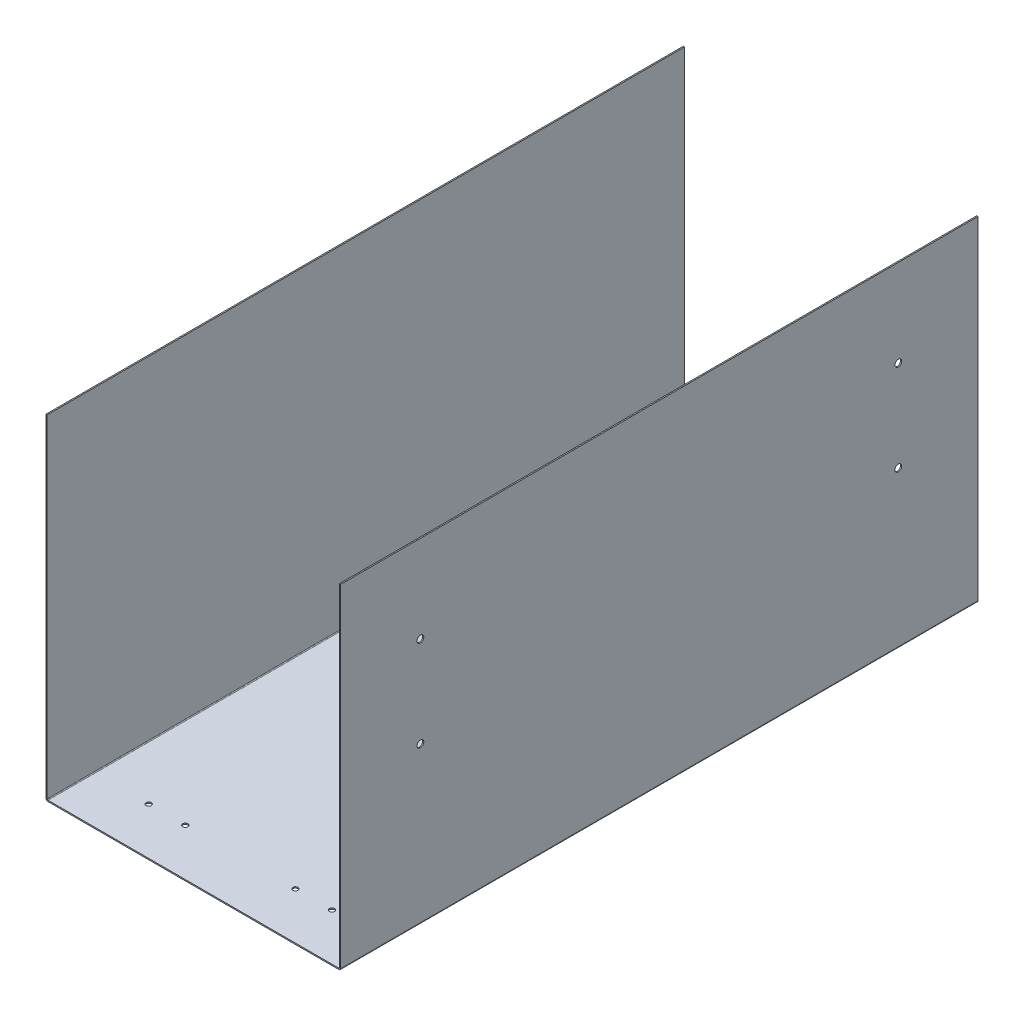
ISO-10303-21;
HEADER;
FILE_DESCRIPTION(('STEP AP214'),'2;1');
FILE_NAME('part.step','',(''),(''),'','','');
FILE_SCHEMA(('AUTOMOTIVE_DESIGN { 1 0 10303 214 1 1 1 1 }'));
ENDSEC;
DATA;
#1=APPLICATION_CONTEXT('core data for automotive mechanical design processes');
#2=APPLICATION_PROTOCOL_DEFINITION('international standard','automotive_design',2000,#1);
#3=PRODUCT_CONTEXT('',#1,'mechanical');
#4=PRODUCT('Part','Part','',(#3));
#5=PRODUCT_RELATED_PRODUCT_CATEGORY('part','',(#4));
#6=PRODUCT_DEFINITION_FORMATION('','',#4);
#7=PRODUCT_DEFINITION_CONTEXT('part definition',#1,'design');
#8=PRODUCT_DEFINITION('design','',#6,#7);
#9=PRODUCT_DEFINITION_SHAPE('','',#8);
#10=(LENGTH_UNIT() NAMED_UNIT(*) SI_UNIT(.MILLI.,.METRE.));
#11=(NAMED_UNIT(*) PLANE_ANGLE_UNIT() SI_UNIT($,.RADIAN.));
#12=(NAMED_UNIT(*) SI_UNIT($,.STERADIAN.) SOLID_ANGLE_UNIT());
#13=UNCERTAINTY_MEASURE_WITH_UNIT(LENGTH_MEASURE(1.E-05),#10,'distance_accuracy_value','');
#14=(GEOMETRIC_REPRESENTATION_CONTEXT(3) GLOBAL_UNCERTAINTY_ASSIGNED_CONTEXT((#13)) GLOBAL_UNIT_ASSIGNED_CONTEXT((#10,
#11,#12)) REPRESENTATION_CONTEXT('',''));
#15=CARTESIAN_POINT('',(0.,0.,0.));
#16=DIRECTION('',(0.,0.,1.));
#17=DIRECTION('',(1.,0.,0.));
#18=AXIS2_PLACEMENT_3D('',#15,#16,#17);
#19=CARTESIAN_POINT('',(182.5,1.11022302462516E-13,400.));
#20=DIRECTION('',(0.,0.,1.));
#21=DIRECTION('',(1.,0.,0.));
#22=AXIS2_PLACEMENT_3D('',#19,#20,#21);
#23=PLANE('',#22);
#24=DIRECTION('',(0.,1.,0.));
#25=VECTOR('',#24,1.);
#26=CARTESIAN_POINT('',(182.5,1.11022302462516E-13,400.));
#27=LINE('',#26,#25);
#28=CARTESIAN_POINT('',(182.5,1.11022302462516E-13,400.));
#29=VERTEX_POINT('',#28);
#30=CARTESIAN_POINT('',(182.5,1.50000000000006,400.));
#31=VERTEX_POINT('',#30);
#32=EDGE_CURVE('E11',#29,#31,#27,.T.);
#33=ORIENTED_EDGE('',*,*,#32,.F.);
#34=CARTESIAN_POINT('',(182.5,2.50000000000006,400.));
#35=DIRECTION('',(0.,0.,1.));
#36=DIRECTION('',(1.,0.,0.));
#37=AXIS2_PLACEMENT_3D('',#34,#35,#36);
#38=CIRCLE('',#37,2.5);
#39=CARTESIAN_POINT('',(185.,2.50000000000006,400.));
#40=VERTEX_POINT('',#39);
#41=EDGE_CURVE('E321',#40,#29,#38,.F.);
#42=ORIENTED_EDGE('',*,*,#41,.F.);
#43=DIRECTION('',(1.,0.,0.));
#44=VECTOR('',#43,1.);
#45=CARTESIAN_POINT('',(183.5,2.50000000000006,400.));
#46=LINE('',#45,#44);
#47=CARTESIAN_POINT('',(183.5,2.50000000000006,400.));
#48=VERTEX_POINT('',#47);
#49=EDGE_CURVE('E55',#48,#40,#46,.T.);
#50=ORIENTED_EDGE('',*,*,#49,.F.);
#51=CARTESIAN_POINT('',(182.5,2.50000000000006,400.));
#52=DIRECTION('',(0.,0.,1.));
#53=DIRECTION('',(1.,0.,0.));
#54=AXIS2_PLACEMENT_3D('',#51,#52,#53);
#55=CIRCLE('',#54,1.);
#56=EDGE_CURVE('E157',#48,#31,#55,.F.);
#57=ORIENTED_EDGE('',*,*,#56,.T.);
#58=EDGE_LOOP('',(#33,#42,#50,#57));
#59=FACE_BOUND('',#58,.T.);
#60=ADVANCED_FACE('F46',(#59),#23,.T.);
#61=CARTESIAN_POINT('',(183.5,2.50000000000006,400.));
#62=DIRECTION('',(0.,0.,1.));
#63=DIRECTION('',(1.,0.,0.));
#64=AXIS2_PLACEMENT_3D('',#61,#62,#63);
#65=PLANE('',#64);
#66=DIRECTION('',(-1.,0.,0.));
#67=VECTOR('',#66,1.);
#68=CARTESIAN_POINT('',(-185.,0.,400.));
#69=LINE('',#68,#67);
#70=CARTESIAN_POINT('',(-182.5,0.,400.));
#71=VERTEX_POINT('',#70);
#72=EDGE_CURVE('E151',#29,#71,#69,.T.);
#73=ORIENTED_EDGE('',*,*,#72,.F.);
#74=ORIENTED_EDGE('',*,*,#32,.T.);
#75=DIRECTION('',(-1.,0.,0.));
#76=VECTOR('',#75,1.);
#77=CARTESIAN_POINT('',(-185.,1.49999999999995,400.));
#78=LINE('',#77,#76);
#79=CARTESIAN_POINT('',(-182.5,1.49999999999995,400.));
#80=VERTEX_POINT('',#79);
#81=EDGE_CURVE('E148',#31,#80,#78,.T.);
#82=ORIENTED_EDGE('',*,*,#81,.T.);
#83=DIRECTION('',(0.,-1.,0.));
#84=VECTOR('',#83,1.);
#85=CARTESIAN_POINT('',(-182.5,1.49999999999995,400.));
#86=LINE('',#85,#84);
#87=EDGE_CURVE('E240',#80,#71,#86,.T.);
#88=ORIENTED_EDGE('',*,*,#87,.T.);
#89=EDGE_LOOP('',(#73,#74,#82,#88));
#90=FACE_BOUND('',#89,.T.);
#91=ADVANCED_FACE('F146',(#90),#65,.T.);
#92=CARTESIAN_POINT('',(185.,2.50000000000006,-400.));
#93=DIRECTION('',(0.,0.,-1.));
#94=DIRECTION('',(-1.,0.,0.));
#95=AXIS2_PLACEMENT_3D('',#92,#93,#94);
#96=PLANE('',#95);
#97=DIRECTION('',(-1.,0.,0.));
#98=VECTOR('',#97,1.);
#99=CARTESIAN_POINT('',(185.,2.50000000000006,-400.));
#100=LINE('',#99,#98);
#101=CARTESIAN_POINT('',(185.,2.50000000000006,-400.));
#102=VERTEX_POINT('',#101);
#103=CARTESIAN_POINT('',(183.5,2.50000000000006,-400.));
#104=VERTEX_POINT('',#103);
#105=EDGE_CURVE('E245',#102,#104,#100,.T.);
#106=ORIENTED_EDGE('',*,*,#105,.F.);
#107=CARTESIAN_POINT('',(182.5,2.50000000000006,-400.));
#108=DIRECTION('',(0.,0.,1.));
#109=DIRECTION('',(1.,0.,0.));
#110=AXIS2_PLACEMENT_3D('',#107,#108,#109);
#111=CIRCLE('',#110,2.5);
#112=CARTESIAN_POINT('',(182.5,1.11022302462516E-13,-400.));
#113=VERTEX_POINT('',#112);
#114=EDGE_CURVE('E197',#102,#113,#111,.F.);
#115=ORIENTED_EDGE('',*,*,#114,.T.);
#116=DIRECTION('',(0.,-1.,0.));
#117=VECTOR('',#116,1.);
#118=CARTESIAN_POINT('',(182.5,1.50000000000006,-400.));
#119=LINE('',#118,#117);
#120=CARTESIAN_POINT('',(182.5,1.50000000000006,-400.));
#121=VERTEX_POINT('',#120);
#122=EDGE_CURVE('E243',#121,#113,#119,.T.);
#123=ORIENTED_EDGE('',*,*,#122,.F.);
#124=CARTESIAN_POINT('',(182.5,2.50000000000006,-400.));
#125=DIRECTION('',(0.,0.,1.));
#126=DIRECTION('',(1.,0.,0.));
#127=AXIS2_PLACEMENT_3D('',#124,#125,#126);
#128=CIRCLE('',#127,1.);
#129=EDGE_CURVE('E169',#104,#121,#128,.F.);
#130=ORIENTED_EDGE('',*,*,#129,.F.);
#131=EDGE_LOOP('',(#106,#115,#123,#130));
#132=FACE_BOUND('',#131,.T.);
#133=ADVANCED_FACE('F339',(#132),#96,.T.);
#134=CARTESIAN_POINT('',(182.5,1.50000000000006,-400.));
#135=DIRECTION('',(0.,0.,-1.));
#136=DIRECTION('',(-1.,0.,0.));
#137=AXIS2_PLACEMENT_3D('',#134,#135,#136);
#138=PLANE('',#137);
#139=DIRECTION('',(0.,-1.,0.));
#140=VECTOR('',#139,1.);
#141=CARTESIAN_POINT('',(185.,1.11022302462516E-13,-400.));
#142=LINE('',#141,#140);
#143=CARTESIAN_POINT('',(185.,420.,-400.));
#144=VERTEX_POINT('',#143);
#145=EDGE_CURVE('E200',#144,#102,#142,.T.);
#146=ORIENTED_EDGE('',*,*,#145,.T.);
#147=ORIENTED_EDGE('',*,*,#105,.T.);
#148=DIRECTION('',(0.,-1.,0.));
#149=VECTOR('',#148,1.);
#150=CARTESIAN_POINT('',(183.5,1.11022302462516E-13,-400.));
#151=LINE('',#150,#149);
#152=CARTESIAN_POINT('',(183.5,420.,-400.));
#153=VERTEX_POINT('',#152);
#154=EDGE_CURVE('E206',#153,#104,#151,.T.);
#155=ORIENTED_EDGE('',*,*,#154,.F.);
#156=DIRECTION('',(1.,0.,0.));
#157=VECTOR('',#156,1.);
#158=CARTESIAN_POINT('',(183.5,420.,-400.));
#159=LINE('',#158,#157);
#160=EDGE_CURVE('E203',#153,#144,#159,.T.);
#161=ORIENTED_EDGE('',*,*,#160,.T.);
#162=EDGE_LOOP('',(#146,#147,#155,#161));
#163=FACE_BOUND('',#162,.T.);
#164=ADVANCED_FACE('F384',(#163),#138,.T.);
#165=CARTESIAN_POINT('',(-185.,2.49999999999995,400.));
#166=DIRECTION('',(0.,0.,1.));
#167=DIRECTION('',(1.,0.,0.));
#168=AXIS2_PLACEMENT_3D('',#165,#166,#167);
#169=PLANE('',#168);
#170=DIRECTION('',(1.,0.,0.));
#171=VECTOR('',#170,1.);
#172=CARTESIAN_POINT('',(-185.,2.49999999999995,400.));
#173=LINE('',#172,#171);
#174=CARTESIAN_POINT('',(-185.,2.49999999999995,400.));
#175=VERTEX_POINT('',#174);
#176=CARTESIAN_POINT('',(-183.5,2.49999999999995,400.));
#177=VERTEX_POINT('',#176);
#178=EDGE_CURVE('E64',#175,#177,#173,.T.);
#179=ORIENTED_EDGE('',*,*,#178,.F.);
#180=CARTESIAN_POINT('',(-182.5,2.49999999999995,400.));
#181=DIRECTION('',(0.,0.,1.));
#182=DIRECTION('',(1.,0.,0.));
#183=AXIS2_PLACEMENT_3D('',#180,#181,#182);
#184=CIRCLE('',#183,2.5);
#185=EDGE_CURVE('E317',#71,#175,#184,.F.);
#186=ORIENTED_EDGE('',*,*,#185,.F.);
#187=ORIENTED_EDGE('',*,*,#87,.F.);
#188=CARTESIAN_POINT('',(-182.5,2.49999999999995,400.));
#189=DIRECTION('',(0.,0.,1.));
#190=DIRECTION('',(1.,0.,0.));
#191=AXIS2_PLACEMENT_3D('',#188,#189,#190);
#192=CIRCLE('',#191,1.);
#193=EDGE_CURVE('E177',#80,#177,#192,.F.);
#194=ORIENTED_EDGE('',*,*,#193,.T.);
#195=EDGE_LOOP('',(#179,#186,#187,#194));
#196=FACE_BOUND('',#195,.T.);
#197=ADVANCED_FACE('F389',(#196),#169,.T.);
#198=CARTESIAN_POINT('',(-182.5,1.49999999999995,400.));
#199=DIRECTION('',(0.,0.,1.));
#200=DIRECTION('',(1.,0.,0.));
#201=AXIS2_PLACEMENT_3D('',#198,#199,#200);
#202=PLANE('',#201);
#203=DIRECTION('',(0.,1.,0.));
#204=VECTOR('',#203,1.);
#205=CARTESIAN_POINT('',(-185.,0.,400.));
#206=LINE('',#205,#204);
#207=CARTESIAN_POINT('',(-185.,420.,400.));
#208=VERTEX_POINT('',#207);
#209=EDGE_CURVE('E314',#175,#208,#206,.T.);
#210=ORIENTED_EDGE('',*,*,#209,.F.);
#211=ORIENTED_EDGE('',*,*,#178,.T.);
#212=DIRECTION('',(0.,1.,0.));
#213=VECTOR('',#212,1.);
#214=CARTESIAN_POINT('',(-183.5,0.,400.));
#215=LINE('',#214,#213);
#216=CARTESIAN_POINT('',(-183.5,420.,400.));
#217=VERTEX_POINT('',#216);
#218=EDGE_CURVE('E118',#177,#217,#215,.T.);
#219=ORIENTED_EDGE('',*,*,#218,.T.);
#220=DIRECTION('',(1.,0.,0.));
#221=VECTOR('',#220,1.);
#222=CARTESIAN_POINT('',(-185.,420.,400.));
#223=LINE('',#222,#221);
#224=EDGE_CURVE('E311',#208,#217,#223,.T.);
#225=ORIENTED_EDGE('',*,*,#224,.F.);
#226=EDGE_LOOP('',(#210,#211,#219,#225));
#227=FACE_BOUND('',#226,.T.);
#228=ADVANCED_FACE('F366',(#227),#202,.T.);
#229=CARTESIAN_POINT('',(-182.5,0.,-400.));
#230=DIRECTION('',(0.,0.,-1.));
#231=DIRECTION('',(-1.,0.,0.));
#232=AXIS2_PLACEMENT_3D('',#229,#230,#231);
#233=PLANE('',#232);
#234=DIRECTION('',(0.,1.,0.));
#235=VECTOR('',#234,1.);
#236=CARTESIAN_POINT('',(-182.5,0.,-400.));
#237=LINE('',#236,#235);
#238=CARTESIAN_POINT('',(-182.5,0.,-400.));
#239=VERTEX_POINT('',#238);
#240=CARTESIAN_POINT('',(-182.5,1.49999999999995,-400.));
#241=VERTEX_POINT('',#240);
#242=EDGE_CURVE('E105',#239,#241,#237,.T.);
#243=ORIENTED_EDGE('',*,*,#242,.F.);
#244=CARTESIAN_POINT('',(-182.5,2.49999999999995,-400.));
#245=DIRECTION('',(0.,0.,1.));
#246=DIRECTION('',(1.,0.,0.));
#247=AXIS2_PLACEMENT_3D('',#244,#245,#246);
#248=CIRCLE('',#247,2.5);
#249=CARTESIAN_POINT('',(-185.,2.49999999999995,-400.));
#250=VERTEX_POINT('',#249);
#251=EDGE_CURVE('E193',#239,#250,#248,.F.);
#252=ORIENTED_EDGE('',*,*,#251,.T.);
#253=DIRECTION('',(-1.,0.,0.));
#254=VECTOR('',#253,1.);
#255=CARTESIAN_POINT('',(-183.5,2.49999999999995,-400.));
#256=LINE('',#255,#254);
#257=CARTESIAN_POINT('',(-183.5,2.49999999999995,-400.));
#258=VERTEX_POINT('',#257);
#259=EDGE_CURVE('E112',#258,#250,#256,.T.);
#260=ORIENTED_EDGE('',*,*,#259,.F.);
#261=CARTESIAN_POINT('',(-182.5,2.49999999999995,-400.));
#262=DIRECTION('',(0.,0.,1.));
#263=DIRECTION('',(1.,0.,0.));
#264=AXIS2_PLACEMENT_3D('',#261,#262,#263);
#265=CIRCLE('',#264,1.);
#266=EDGE_CURVE('E212',#241,#258,#265,.F.);
#267=ORIENTED_EDGE('',*,*,#266,.F.);
#268=EDGE_LOOP('',(#243,#252,#260,#267));
#269=FACE_BOUND('',#268,.T.);
#270=ADVANCED_FACE('F354',(#269),#233,.T.);
#271=CARTESIAN_POINT('',(-183.5,2.49999999999995,-400.));
#272=DIRECTION('',(0.,0.,-1.));
#273=DIRECTION('',(-1.,0.,0.));
#274=AXIS2_PLACEMENT_3D('',#271,#272,#273);
#275=PLANE('',#274);
#276=DIRECTION('',(-1.,0.,0.));
#277=VECTOR('',#276,1.);
#278=CARTESIAN_POINT('',(-185.,0.,-400.));
#279=LINE('',#278,#277);
#280=EDGE_CURVE('E195',#113,#239,#279,.T.);
#281=ORIENTED_EDGE('',*,*,#280,.T.);
#282=ORIENTED_EDGE('',*,*,#242,.T.);
#283=DIRECTION('',(-1.,0.,0.));
#284=VECTOR('',#283,1.);
#285=CARTESIAN_POINT('',(-185.,1.49999999999995,-400.));
#286=LINE('',#285,#284);
#287=EDGE_CURVE('E210',#121,#241,#286,.T.);
#288=ORIENTED_EDGE('',*,*,#287,.F.);
#289=ORIENTED_EDGE('',*,*,#122,.T.);
#290=EDGE_LOOP('',(#281,#282,#288,#289));
#291=FACE_BOUND('',#290,.T.);
#292=ADVANCED_FACE('F341',(#291),#275,.T.);
#293=CARTESIAN_POINT('',(-183.5,0.,400.));
#294=DIRECTION('',(-1.,0.,0.));
#295=DIRECTION('',(0.,0.,1.));
#296=AXIS2_PLACEMENT_3D('',#293,#294,#295);
#297=PLANE('',#296);
#298=DIRECTION('',(0.,1.,0.));
#299=VECTOR('',#298,1.);
#300=CARTESIAN_POINT('',(-183.5,0.,-400.));
#301=LINE('',#300,#299);
#302=CARTESIAN_POINT('',(-183.5,420.,-400.));
#303=VERTEX_POINT('',#302);
#304=EDGE_CURVE('E183',#258,#303,#301,.T.);
#305=ORIENTED_EDGE('',*,*,#304,.T.);
#306=DIRECTION('',(0.,0.,-1.));
#307=VECTOR('',#306,1.);
#308=CARTESIAN_POINT('',(-183.5,420.,400.));
#309=LINE('',#308,#307);
#310=EDGE_CURVE('E236',#217,#303,#309,.T.);
#311=ORIENTED_EDGE('',*,*,#310,.F.);
#312=ORIENTED_EDGE('',*,*,#218,.F.);
#313=DIRECTION('',(0.,0.,-1.));
#314=VECTOR('',#313,1.);
#315=CARTESIAN_POINT('',(-183.5,2.49999999999995,400.));
#316=LINE('',#315,#314);
#317=EDGE_CURVE('E179',#177,#258,#316,.T.);
#318=ORIENTED_EDGE('',*,*,#317,.T.);
#319=EDGE_LOOP('',(#305,#311,#312,#318));
#320=FACE_BOUND('',#319,.T.);
#321=ADVANCED_FACE('F360',(#320),#297,.F.);
#322=CARTESIAN_POINT('',(-185.,420.,400.));
#323=DIRECTION('',(0.,1.,0.));
#324=DIRECTION('',(0.,0.,1.));
#325=AXIS2_PLACEMENT_3D('',#322,#323,#324);
#326=PLANE('',#325);
#327=DIRECTION('',(1.,0.,0.));
#328=VECTOR('',#327,1.);
#329=CARTESIAN_POINT('',(-185.,420.,-400.));
#330=LINE('',#329,#328);
#331=CARTESIAN_POINT('',(-185.,420.,-400.));
#332=VERTEX_POINT('',#331);
#333=EDGE_CURVE('E186',#332,#303,#330,.T.);
#334=ORIENTED_EDGE('',*,*,#333,.F.);
#335=DIRECTION('',(0.,0.,-1.));
#336=VECTOR('',#335,1.);
#337=CARTESIAN_POINT('',(-185.,420.,400.));
#338=LINE('',#337,#336);
#339=EDGE_CURVE('E234',#208,#332,#338,.T.);
#340=ORIENTED_EDGE('',*,*,#339,.F.);
#341=ORIENTED_EDGE('',*,*,#224,.T.);
#342=ORIENTED_EDGE('',*,*,#310,.T.);
#343=EDGE_LOOP('',(#334,#340,#341,#342));
#344=FACE_BOUND('',#343,.T.);
#345=ADVANCED_FACE('F365',(#344),#326,.T.);
#346=CARTESIAN_POINT('',(-185.,0.,400.));
#347=DIRECTION('',(-1.,0.,0.));
#348=DIRECTION('',(0.,0.,1.));
#349=AXIS2_PLACEMENT_3D('',#346,#347,#348);
#350=PLANE('',#349);
#351=DIRECTION('',(0.,1.,0.));
#352=VECTOR('',#351,1.);
#353=CARTESIAN_POINT('',(-185.,0.,-400.));
#354=LINE('',#353,#352);
#355=EDGE_CURVE('E190',#250,#332,#354,.T.);
#356=ORIENTED_EDGE('',*,*,#355,.F.);
#357=DIRECTION('',(0.,0.,-1.));
#358=VECTOR('',#357,1.);
#359=CARTESIAN_POINT('',(-185.,2.49999999999995,400.));
#360=LINE('',#359,#358);
#361=EDGE_CURVE('E231',#175,#250,#360,.T.);
#362=ORIENTED_EDGE('',*,*,#361,.F.);
#363=ORIENTED_EDGE('',*,*,#209,.T.);
#364=ORIENTED_EDGE('',*,*,#339,.T.);
#365=EDGE_LOOP('',(#356,#362,#363,#364));
#366=FACE_BOUND('',#365,.T.);
#367=ADVANCED_FACE('F368',(#366),#350,.T.);
#368=CARTESIAN_POINT('',(-182.5,2.49999999999995,400.));
#369=DIRECTION('',(0.,0.,-1.));
#370=DIRECTION('',(-1.,0.,0.));
#371=AXIS2_PLACEMENT_3D('',#368,#369,#370);
#372=CYLINDRICAL_SURFACE('',#371,2.5);
#373=ORIENTED_EDGE('',*,*,#251,.F.);
#374=DIRECTION('',(0.,0.,-1.));
#375=VECTOR('',#374,1.);
#376=CARTESIAN_POINT('',(-182.5,0.,400.));
#377=LINE('',#376,#375);
#378=EDGE_CURVE('E228',#71,#239,#377,.T.);
#379=ORIENTED_EDGE('',*,*,#378,.F.);
#380=ORIENTED_EDGE('',*,*,#185,.T.);
#381=ORIENTED_EDGE('',*,*,#361,.T.);
#382=EDGE_LOOP('',(#373,#379,#380,#381));
#383=FACE_BOUND('',#382,.T.);
#384=ADVANCED_FACE('F351',(#383),#372,.T.);
#385=CARTESIAN_POINT('',(-185.,0.,400.));
#386=DIRECTION('',(0.,-1.,0.));
#387=DIRECTION('',(1.,0.,0.));
#388=AXIS2_PLACEMENT_3D('',#385,#386,#387);
#389=PLANE('',#388);
#390=CARTESIAN_POINT('',(-69.1253140723345,0.,341.));
#391=DIRECTION('',(0.,-1.,0.));
#392=DIRECTION('',(1.,0.,0.));
#393=AXIS2_PLACEMENT_3D('',#390,#391,#392);
#394=CIRCLE('',#393,3.25000000000002);
#395=CARTESIAN_POINT('',(-65.8753140723344,0.,341.));
#396=VERTEX_POINT('',#395);
#397=EDGE_CURVE('E296',#396,#396,#394,.T.);
#398=ORIENTED_EDGE('',*,*,#397,.F.);
#399=EDGE_LOOP('',(#398));
#400=FACE_BOUND('',#399,.T.);
#401=CARTESIAN_POINT('',(69.1253140723345,0.,341.));
#402=DIRECTION('',(0.,-1.,0.));
#403=DIRECTION('',(-1.,0.,0.));
#404=AXIS2_PLACEMENT_3D('',#401,#402,#403);
#405=CIRCLE('',#404,3.25000000000002);
#406=CARTESIAN_POINT('',(65.8753140723344,0.,341.));
#407=VERTEX_POINT('',#406);
#408=EDGE_CURVE('E299',#407,#407,#405,.T.);
#409=ORIENTED_EDGE('',*,*,#408,.F.);
#410=EDGE_LOOP('',(#409));
#411=FACE_BOUND('',#410,.T.);
#412=CARTESIAN_POINT('',(115.125314072335,0.,341.));
#413=DIRECTION('',(0.,-1.,0.));
#414=DIRECTION('',(-1.,0.,0.));
#415=AXIS2_PLACEMENT_3D('',#412,#413,#414);
#416=CIRCLE('',#415,3.25000000000001);
#417=CARTESIAN_POINT('',(111.875314072335,0.,341.));
#418=VERTEX_POINT('',#417);
#419=EDGE_CURVE('E302',#418,#418,#416,.T.);
#420=ORIENTED_EDGE('',*,*,#419,.F.);
#421=EDGE_LOOP('',(#420));
#422=FACE_BOUND('',#421,.T.);
#423=CARTESIAN_POINT('',(115.125314072335,0.,-341.));
#424=DIRECTION('',(0.,-1.,0.));
#425=DIRECTION('',(1.,0.,0.));
#426=AXIS2_PLACEMENT_3D('',#423,#424,#425);
#427=CIRCLE('',#426,3.25000000000001);
#428=CARTESIAN_POINT('',(118.375314072335,0.,-341.));
#429=VERTEX_POINT('',#428);
#430=EDGE_CURVE('E305',#429,#429,#427,.T.);
#431=ORIENTED_EDGE('',*,*,#430,.F.);
#432=EDGE_LOOP('',(#431));
#433=FACE_BOUND('',#432,.T.);
#434=CARTESIAN_POINT('',(69.1253140723345,0.,-341.));
#435=DIRECTION('',(0.,-1.,0.));
#436=DIRECTION('',(1.,0.,0.));
#437=AXIS2_PLACEMENT_3D('',#434,#435,#436);
#438=CIRCLE('',#437,3.25000000000002);
#439=CARTESIAN_POINT('',(72.3753140723345,0.,-341.));
#440=VERTEX_POINT('',#439);
#441=EDGE_CURVE('E292',#440,#440,#438,.T.);
#442=ORIENTED_EDGE('',*,*,#441,.F.);
#443=EDGE_LOOP('',(#442));
#444=FACE_BOUND('',#443,.T.);
#445=CARTESIAN_POINT('',(-69.1253140723345,0.,-341.));
#446=DIRECTION('',(0.,-1.,0.));
#447=DIRECTION('',(-1.,0.,0.));
#448=AXIS2_PLACEMENT_3D('',#445,#446,#447);
#449=CIRCLE('',#448,3.25000000000002);
#450=CARTESIAN_POINT('',(-72.3753140723345,0.,-341.));
#451=VERTEX_POINT('',#450);
#452=EDGE_CURVE('E287',#451,#451,#449,.T.);
#453=ORIENTED_EDGE('',*,*,#452,.F.);
#454=EDGE_LOOP('',(#453));
#455=FACE_BOUND('',#454,.T.);
#456=CARTESIAN_POINT('',(-115.125314072335,0.,-341.));
#457=DIRECTION('',(0.,-1.,0.));
#458=DIRECTION('',(-1.,0.,0.));
#459=AXIS2_PLACEMENT_3D('',#456,#457,#458);
#460=CIRCLE('',#459,3.25000000000001);
#461=CARTESIAN_POINT('',(-118.375314072335,0.,-341.));
#462=VERTEX_POINT('',#461);
#463=EDGE_CURVE('E283',#462,#462,#460,.T.);
#464=ORIENTED_EDGE('',*,*,#463,.F.);
#465=EDGE_LOOP('',(#464));
#466=FACE_BOUND('',#465,.T.);
#467=CARTESIAN_POINT('',(-115.125314072335,0.,341.));
#468=DIRECTION('',(0.,-1.,0.));
#469=DIRECTION('',(1.,0.,0.));
#470=AXIS2_PLACEMENT_3D('',#467,#468,#469);
#471=CIRCLE('',#470,3.25000000000001);
#472=CARTESIAN_POINT('',(-111.875314072335,0.,341.));
#473=VERTEX_POINT('',#472);
#474=EDGE_CURVE('E252',#473,#473,#471,.T.);
#475=ORIENTED_EDGE('',*,*,#474,.F.);
#476=EDGE_LOOP('',(#475));
#477=FACE_BOUND('',#476,.T.);
#478=ORIENTED_EDGE('',*,*,#280,.F.);
#479=DIRECTION('',(0.,0.,-1.));
#480=VECTOR('',#479,1.);
#481=CARTESIAN_POINT('',(182.5,1.11022302462516E-13,400.));
#482=LINE('',#481,#480);
#483=EDGE_CURVE('E225',#29,#113,#482,.T.);
#484=ORIENTED_EDGE('',*,*,#483,.F.);
#485=ORIENTED_EDGE('',*,*,#72,.T.);
#486=ORIENTED_EDGE('',*,*,#378,.T.);
#487=EDGE_LOOP('',(#478,#484,#485,#486));
#488=FACE_BOUND('',#487,.T.);
#489=ADVANCED_FACE('F346',(#400,#411,#422,#433,#444,#455,#466,#477,#488),#389,.T.);
#490=CARTESIAN_POINT('',(182.5,2.50000000000006,400.));
#491=DIRECTION('',(0.,0.,-1.));
#492=DIRECTION('',(-1.,0.,0.));
#493=AXIS2_PLACEMENT_3D('',#490,#491,#492);
#494=CYLINDRICAL_SURFACE('',#493,2.5);
#495=ORIENTED_EDGE('',*,*,#114,.F.);
#496=DIRECTION('',(0.,0.,-1.));
#497=VECTOR('',#496,1.);
#498=CARTESIAN_POINT('',(185.,2.50000000000006,400.));
#499=LINE('',#498,#497);
#500=EDGE_CURVE('E222',#40,#102,#499,.T.);
#501=ORIENTED_EDGE('',*,*,#500,.F.);
#502=ORIENTED_EDGE('',*,*,#41,.T.);
#503=ORIENTED_EDGE('',*,*,#483,.T.);
#504=EDGE_LOOP('',(#495,#501,#502,#503));
#505=FACE_BOUND('',#504,.T.);
#506=ADVANCED_FACE('F344',(#505),#494,.T.);
#507=CARTESIAN_POINT('',(185.,1.11022302462516E-13,400.));
#508=DIRECTION('',(1.,0.,0.));
#509=DIRECTION('',(0.,1.,0.));
#510=AXIS2_PLACEMENT_3D('',#507,#508,#509);
#511=PLANE('',#510);
#512=CARTESIAN_POINT('',(185.,310.5,-300.));
#513=DIRECTION('',(1.,0.,0.));
#514=DIRECTION('',(0.,1.,0.));
#515=AXIS2_PLACEMENT_3D('',#512,#513,#514);
#516=CIRCLE('',#515,4.25000000000001);
#517=CARTESIAN_POINT('',(185.,314.75,-300.));
#518=VERTEX_POINT('',#517);
#519=EDGE_CURVE('E743',#518,#518,#516,.T.);
#520=ORIENTED_EDGE('',*,*,#519,.F.);
#521=EDGE_LOOP('',(#520));
#522=FACE_BOUND('',#521,.T.);
#523=CARTESIAN_POINT('',(185.,196.5,-300.));
#524=DIRECTION('',(1.,0.,0.));
#525=DIRECTION('',(0.,1.,0.));
#526=AXIS2_PLACEMENT_3D('',#523,#524,#525);
#527=CIRCLE('',#526,4.25000000000001);
#528=CARTESIAN_POINT('',(185.,200.75,-300.));
#529=VERTEX_POINT('',#528);
#530=EDGE_CURVE('E744',#529,#529,#527,.T.);
#531=ORIENTED_EDGE('',*,*,#530,.F.);
#532=EDGE_LOOP('',(#531));
#533=FACE_BOUND('',#532,.T.);
#534=CARTESIAN_POINT('',(185.,196.5,300.));
#535=DIRECTION('',(1.,0.,0.));
#536=DIRECTION('',(0.,1.,0.));
#537=AXIS2_PLACEMENT_3D('',#534,#535,#536);
#538=CIRCLE('',#537,4.24999999999995);
#539=CARTESIAN_POINT('',(185.,200.75,300.));
#540=VERTEX_POINT('',#539);
#541=EDGE_CURVE('E747',#540,#540,#538,.T.);
#542=ORIENTED_EDGE('',*,*,#541,.F.);
#543=EDGE_LOOP('',(#542));
#544=FACE_BOUND('',#543,.T.);
#545=CARTESIAN_POINT('',(185.,310.5,300.));
#546=DIRECTION('',(1.,0.,0.));
#547=DIRECTION('',(0.,1.,0.));
#548=AXIS2_PLACEMENT_3D('',#545,#546,#547);
#549=CIRCLE('',#548,4.25000000000001);
#550=CARTESIAN_POINT('',(185.,314.75,300.));
#551=VERTEX_POINT('',#550);
#552=EDGE_CURVE('E276',#551,#551,#549,.T.);
#553=ORIENTED_EDGE('',*,*,#552,.F.);
#554=EDGE_LOOP('',(#553));
#555=FACE_BOUND('',#554,.T.);
#556=ORIENTED_EDGE('',*,*,#145,.F.);
#557=DIRECTION('',(0.,0.,-1.));
#558=VECTOR('',#557,1.);
#559=CARTESIAN_POINT('',(185.,420.,400.));
#560=LINE('',#559,#558);
#561=CARTESIAN_POINT('',(185.,420.,400.));
#562=VERTEX_POINT('',#561);
#563=EDGE_CURVE('E220',#562,#144,#560,.T.);
#564=ORIENTED_EDGE('',*,*,#563,.F.);
#565=DIRECTION('',(0.,-1.,0.));
#566=VECTOR('',#565,1.);
#567=CARTESIAN_POINT('',(185.,1.11022302462516E-13,400.));
#568=LINE('',#567,#566);
#569=EDGE_CURVE('E323',#562,#40,#568,.T.);
#570=ORIENTED_EDGE('',*,*,#569,.T.);
#571=ORIENTED_EDGE('',*,*,#500,.T.);
#572=EDGE_LOOP('',(#556,#564,#570,#571));
#573=FACE_BOUND('',#572,.T.);
#574=ADVANCED_FACE('F443',(#522,#533,#544,#555,#573),#511,.T.);
#575=CARTESIAN_POINT('',(183.5,420.,400.));
#576=DIRECTION('',(0.,1.,0.));
#577=DIRECTION('',(0.,0.,1.));
#578=AXIS2_PLACEMENT_3D('',#575,#576,#577);
#579=PLANE('',#578);
#580=ORIENTED_EDGE('',*,*,#160,.F.);
#581=DIRECTION('',(0.,0.,-1.));
#582=VECTOR('',#581,1.);
#583=CARTESIAN_POINT('',(183.5,420.,400.));
#584=LINE('',#583,#582);
#585=CARTESIAN_POINT('',(183.5,420.,400.));
#586=VERTEX_POINT('',#585);
#587=EDGE_CURVE('E218',#586,#153,#584,.T.);
#588=ORIENTED_EDGE('',*,*,#587,.F.);
#589=DIRECTION('',(1.,0.,0.));
#590=VECTOR('',#589,1.);
#591=CARTESIAN_POINT('',(183.5,420.,400.));
#592=LINE('',#591,#590);
#593=EDGE_CURVE('E326',#586,#562,#592,.T.);
#594=ORIENTED_EDGE('',*,*,#593,.T.);
#595=ORIENTED_EDGE('',*,*,#563,.T.);
#596=EDGE_LOOP('',(#580,#588,#594,#595));
#597=FACE_BOUND('',#596,.T.);
#598=ADVANCED_FACE('F453',(#597),#579,.T.);
#599=CARTESIAN_POINT('',(183.5,1.11022302462516E-13,400.));
#600=DIRECTION('',(1.,0.,0.));
#601=DIRECTION('',(0.,1.,0.));
#602=AXIS2_PLACEMENT_3D('',#599,#600,#601);
#603=PLANE('',#602);
#604=CARTESIAN_POINT('',(183.5,310.5,-300.));
#605=DIRECTION('',(1.,0.,0.));
#606=DIRECTION('',(0.,1.,0.));
#607=AXIS2_PLACEMENT_3D('',#604,#605,#606);
#608=CIRCLE('',#607,4.25000000000001);
#609=CARTESIAN_POINT('',(183.5,314.75,-300.));
#610=VERTEX_POINT('',#609);
#611=EDGE_CURVE('E49',#610,#610,#608,.T.);
#612=ORIENTED_EDGE('',*,*,#611,.T.);
#613=EDGE_LOOP('',(#612));
#614=FACE_BOUND('',#613,.T.);
#615=CARTESIAN_POINT('',(183.5,196.5,-300.));
#616=DIRECTION('',(1.,0.,0.));
#617=DIRECTION('',(0.,1.,0.));
#618=AXIS2_PLACEMENT_3D('',#615,#616,#617);
#619=CIRCLE('',#618,4.25000000000001);
#620=CARTESIAN_POINT('',(183.5,200.75,-300.));
#621=VERTEX_POINT('',#620);
#622=EDGE_CURVE('E278',#621,#621,#619,.T.);
#623=ORIENTED_EDGE('',*,*,#622,.T.);
#624=EDGE_LOOP('',(#623));
#625=FACE_BOUND('',#624,.T.);
#626=CARTESIAN_POINT('',(183.5,196.5,300.));
#627=DIRECTION('',(1.,0.,0.));
#628=DIRECTION('',(0.,1.,0.));
#629=AXIS2_PLACEMENT_3D('',#626,#627,#628);
#630=CIRCLE('',#629,4.24999999999995);
#631=CARTESIAN_POINT('',(183.5,200.75,300.));
#632=VERTEX_POINT('',#631);
#633=EDGE_CURVE('E275',#632,#632,#630,.T.);
#634=ORIENTED_EDGE('',*,*,#633,.T.);
#635=EDGE_LOOP('',(#634));
#636=FACE_BOUND('',#635,.T.);
#637=CARTESIAN_POINT('',(183.5,310.5,300.));
#638=DIRECTION('',(1.,0.,0.));
#639=DIRECTION('',(0.,1.,0.));
#640=AXIS2_PLACEMENT_3D('',#637,#638,#639);
#641=CIRCLE('',#640,4.25000000000001);
#642=CARTESIAN_POINT('',(183.5,314.75,300.));
#643=VERTEX_POINT('',#642);
#644=EDGE_CURVE('E272',#643,#643,#641,.T.);
#645=ORIENTED_EDGE('',*,*,#644,.T.);
#646=EDGE_LOOP('',(#645));
#647=FACE_BOUND('',#646,.T.);
#648=ORIENTED_EDGE('',*,*,#154,.T.);
#649=DIRECTION('',(0.,0.,-1.));
#650=VECTOR('',#649,1.);
#651=CARTESIAN_POINT('',(183.5,2.50000000000006,400.));
#652=LINE('',#651,#650);
#653=EDGE_CURVE('E171',#48,#104,#652,.T.);
#654=ORIENTED_EDGE('',*,*,#653,.F.);
#655=DIRECTION('',(0.,-1.,0.));
#656=VECTOR('',#655,1.);
#657=CARTESIAN_POINT('',(183.5,1.11022302462516E-13,400.));
#658=LINE('',#657,#656);
#659=EDGE_CURVE('E162',#586,#48,#658,.T.);
#660=ORIENTED_EDGE('',*,*,#659,.F.);
#661=ORIENTED_EDGE('',*,*,#587,.T.);
#662=EDGE_LOOP('',(#648,#654,#660,#661));
#663=FACE_BOUND('',#662,.T.);
#664=ADVANCED_FACE('F336',(#614,#625,#636,#647,#663),#603,.F.);
#665=CARTESIAN_POINT('',(182.5,2.50000000000006,400.));
#666=DIRECTION('',(0.,0.,-1.));
#667=DIRECTION('',(-1.,0.,0.));
#668=AXIS2_PLACEMENT_3D('',#665,#666,#667);
#669=CYLINDRICAL_SURFACE('',#668,1.);
#670=ORIENTED_EDGE('',*,*,#129,.T.);
#671=DIRECTION('',(0.,0.,-1.));
#672=VECTOR('',#671,1.);
#673=CARTESIAN_POINT('',(182.5,1.50000000000006,400.));
#674=LINE('',#673,#672);
#675=EDGE_CURVE('E166',#31,#121,#674,.T.);
#676=ORIENTED_EDGE('',*,*,#675,.F.);
#677=ORIENTED_EDGE('',*,*,#56,.F.);
#678=ORIENTED_EDGE('',*,*,#653,.T.);
#679=EDGE_LOOP('',(#670,#676,#677,#678));
#680=FACE_BOUND('',#679,.T.);
#681=ADVANCED_FACE('F167',(#680),#669,.F.);
#682=CARTESIAN_POINT('',(-185.,1.49999999999995,400.));
#683=DIRECTION('',(0.,-1.,0.));
#684=DIRECTION('',(1.,0.,0.));
#685=AXIS2_PLACEMENT_3D('',#682,#683,#684);
#686=PLANE('',#685);
#687=CARTESIAN_POINT('',(-69.1253140723345,1.50000000000006,341.));
#688=DIRECTION('',(0.,-1.,0.));
#689=DIRECTION('',(1.,0.,0.));
#690=AXIS2_PLACEMENT_3D('',#687,#688,#689);
#691=CIRCLE('',#690,3.25000000000002);
#692=CARTESIAN_POINT('',(-65.8753140723344,1.50000000000006,341.));
#693=VERTEX_POINT('',#692);
#694=EDGE_CURVE('E187',#693,#693,#691,.T.);
#695=ORIENTED_EDGE('',*,*,#694,.T.);
#696=EDGE_LOOP('',(#695));
#697=FACE_BOUND('',#696,.T.);
#698=CARTESIAN_POINT('',(69.1253140723345,1.50000000000006,341.));
#699=DIRECTION('',(0.,-1.,0.));
#700=DIRECTION('',(1.,0.,0.));
#701=AXIS2_PLACEMENT_3D('',#698,#699,#700);
#702=CIRCLE('',#701,3.25000000000002);
#703=CARTESIAN_POINT('',(72.3753140723345,1.50000000000006,341.));
#704=VERTEX_POINT('',#703);
#705=EDGE_CURVE('E267',#704,#704,#702,.T.);
#706=ORIENTED_EDGE('',*,*,#705,.T.);
#707=EDGE_LOOP('',(#706));
#708=FACE_BOUND('',#707,.T.);
#709=CARTESIAN_POINT('',(115.125314072335,1.50000000000006,341.));
#710=DIRECTION('',(0.,-1.,0.));
#711=DIRECTION('',(1.,0.,0.));
#712=AXIS2_PLACEMENT_3D('',#709,#710,#711);
#713=CIRCLE('',#712,3.25000000000001);
#714=CARTESIAN_POINT('',(118.375314072335,1.50000000000006,341.));
#715=VERTEX_POINT('',#714);
#716=EDGE_CURVE('E264',#715,#715,#713,.T.);
#717=ORIENTED_EDGE('',*,*,#716,.T.);
#718=EDGE_LOOP('',(#717));
#719=FACE_BOUND('',#718,.T.);
#720=CARTESIAN_POINT('',(115.125314072335,1.50000000000006,-341.));
#721=DIRECTION('',(0.,-1.,0.));
#722=DIRECTION('',(1.,0.,0.));
#723=AXIS2_PLACEMENT_3D('',#720,#721,#722);
#724=CIRCLE('',#723,3.25000000000001);
#725=CARTESIAN_POINT('',(118.375314072335,1.50000000000006,-341.));
#726=VERTEX_POINT('',#725);
#727=EDGE_CURVE('E261',#726,#726,#724,.T.);
#728=ORIENTED_EDGE('',*,*,#727,.T.);
#729=EDGE_LOOP('',(#728));
#730=FACE_BOUND('',#729,.T.);
#731=CARTESIAN_POINT('',(69.1253140723345,1.50000000000006,-341.));
#732=DIRECTION('',(0.,-1.,0.));
#733=DIRECTION('',(1.,0.,0.));
#734=AXIS2_PLACEMENT_3D('',#731,#732,#733);
#735=CIRCLE('',#734,3.25000000000002);
#736=CARTESIAN_POINT('',(72.3753140723345,1.50000000000006,-341.));
#737=VERTEX_POINT('',#736);
#738=EDGE_CURVE('E258',#737,#737,#735,.T.);
#739=ORIENTED_EDGE('',*,*,#738,.T.);
#740=EDGE_LOOP('',(#739));
#741=FACE_BOUND('',#740,.T.);
#742=CARTESIAN_POINT('',(-69.1253140723345,1.50000000000006,-341.));
#743=DIRECTION('',(0.,-1.,0.));
#744=DIRECTION('',(1.,0.,0.));
#745=AXIS2_PLACEMENT_3D('',#742,#743,#744);
#746=CIRCLE('',#745,3.25000000000002);
#747=CARTESIAN_POINT('',(-65.8753140723344,1.50000000000006,-341.));
#748=VERTEX_POINT('',#747);
#749=EDGE_CURVE('E255',#748,#748,#746,.T.);
#750=ORIENTED_EDGE('',*,*,#749,.T.);
#751=EDGE_LOOP('',(#750));
#752=FACE_BOUND('',#751,.T.);
#753=CARTESIAN_POINT('',(-115.125314072335,1.50000000000006,-341.));
#754=DIRECTION('',(0.,-1.,0.));
#755=DIRECTION('',(1.,0.,0.));
#756=AXIS2_PLACEMENT_3D('',#753,#754,#755);
#757=CIRCLE('',#756,3.25000000000001);
#758=CARTESIAN_POINT('',(-111.875314072335,1.50000000000006,-341.));
#759=VERTEX_POINT('',#758);
#760=EDGE_CURVE('E251',#759,#759,#757,.T.);
#761=ORIENTED_EDGE('',*,*,#760,.T.);
#762=EDGE_LOOP('',(#761));
#763=FACE_BOUND('',#762,.T.);
#764=CARTESIAN_POINT('',(-115.125314072335,1.50000000000006,341.));
#765=DIRECTION('',(0.,-1.,0.));
#766=DIRECTION('',(1.,0.,0.));
#767=AXIS2_PLACEMENT_3D('',#764,#765,#766);
#768=CIRCLE('',#767,3.25000000000001);
#769=CARTESIAN_POINT('',(-111.875314072335,1.50000000000006,341.));
#770=VERTEX_POINT('',#769);
#771=EDGE_CURVE('E248',#770,#770,#768,.T.);
#772=ORIENTED_EDGE('',*,*,#771,.T.);
#773=EDGE_LOOP('',(#772));
#774=FACE_BOUND('',#773,.T.);
#775=ORIENTED_EDGE('',*,*,#287,.T.);
#776=DIRECTION('',(0.,0.,-1.));
#777=VECTOR('',#776,1.);
#778=CARTESIAN_POINT('',(-182.5,1.49999999999995,400.));
#779=LINE('',#778,#777);
#780=EDGE_CURVE('E172',#80,#241,#779,.T.);
#781=ORIENTED_EDGE('',*,*,#780,.F.);
#782=ORIENTED_EDGE('',*,*,#81,.F.);
#783=ORIENTED_EDGE('',*,*,#675,.T.);
#784=EDGE_LOOP('',(#775,#781,#782,#783));
#785=FACE_BOUND('',#784,.T.);
#786=ADVANCED_FACE('F174',(#697,#708,#719,#730,#741,#752,#763,#774,#785),#686,.F.);
#787=CARTESIAN_POINT('',(-182.5,2.49999999999995,400.));
#788=DIRECTION('',(0.,0.,-1.));
#789=DIRECTION('',(-1.,0.,0.));
#790=AXIS2_PLACEMENT_3D('',#787,#788,#789);
#791=CYLINDRICAL_SURFACE('',#790,1.);
#792=ORIENTED_EDGE('',*,*,#266,.T.);
#793=ORIENTED_EDGE('',*,*,#317,.F.);
#794=ORIENTED_EDGE('',*,*,#193,.F.);
#795=ORIENTED_EDGE('',*,*,#780,.T.);
#796=EDGE_LOOP('',(#792,#793,#794,#795));
#797=FACE_BOUND('',#796,.T.);
#798=ADVANCED_FACE('F357',(#797),#791,.F.);
#799=CARTESIAN_POINT('',(-182.5,2.49999999999995,400.));
#800=DIRECTION('',(0.,0.,1.));
#801=DIRECTION('',(1.,0.,0.));
#802=AXIS2_PLACEMENT_3D('',#799,#800,#801);
#803=PLANE('',#802);
#804=ORIENTED_EDGE('',*,*,#659,.T.);
#805=ORIENTED_EDGE('',*,*,#49,.T.);
#806=ORIENTED_EDGE('',*,*,#569,.F.);
#807=ORIENTED_EDGE('',*,*,#593,.F.);
#808=EDGE_LOOP('',(#804,#805,#806,#807));
#809=FACE_BOUND('',#808,.T.);
#810=ADVANCED_FACE('F332',(#809),#803,.T.);
#811=CARTESIAN_POINT('',(-182.5,2.49999999999995,-400.));
#812=DIRECTION('',(0.,0.,1.));
#813=DIRECTION('',(1.,0.,0.));
#814=AXIS2_PLACEMENT_3D('',#811,#812,#813);
#815=PLANE('',#814);
#816=ORIENTED_EDGE('',*,*,#304,.F.);
#817=ORIENTED_EDGE('',*,*,#259,.T.);
#818=ORIENTED_EDGE('',*,*,#355,.T.);
#819=ORIENTED_EDGE('',*,*,#333,.T.);
#820=EDGE_LOOP('',(#816,#817,#818,#819));
#821=FACE_BOUND('',#820,.T.);
#822=ADVANCED_FACE('F362',(#821),#815,.F.);
#823=CARTESIAN_POINT('',(-115.125314072335,10.,341.));
#824=DIRECTION('',(0.,-1.,0.));
#825=DIRECTION('',(1.,0.,0.));
#826=AXIS2_PLACEMENT_3D('',#823,#824,#825);
#827=CYLINDRICAL_SURFACE('',#826,3.25000000000001);
#828=ORIENTED_EDGE('',*,*,#474,.T.);
#829=EDGE_LOOP('',(#828));
#830=FACE_BOUND('',#829,.T.);
#831=ORIENTED_EDGE('',*,*,#771,.F.);
#832=EDGE_LOOP('',(#831));
#833=FACE_BOUND('',#832,.T.);
#834=ADVANCED_FACE('F520',(#830,#833),#827,.F.);
#835=CARTESIAN_POINT('',(-115.125314072335,10.,-341.));
#836=DIRECTION('',(0.,-1.,0.));
#837=DIRECTION('',(1.,0.,0.));
#838=AXIS2_PLACEMENT_3D('',#835,#836,#837);
#839=CYLINDRICAL_SURFACE('',#838,3.25000000000001);
#840=ORIENTED_EDGE('',*,*,#463,.T.);
#841=EDGE_LOOP('',(#840));
#842=FACE_BOUND('',#841,.T.);
#843=ORIENTED_EDGE('',*,*,#760,.F.);
#844=EDGE_LOOP('',(#843));
#845=FACE_BOUND('',#844,.T.);
#846=ADVANCED_FACE('F530',(#842,#845),#839,.F.);
#847=CARTESIAN_POINT('',(-69.1253140723345,10.,-341.));
#848=DIRECTION('',(0.,-1.,0.));
#849=DIRECTION('',(1.,0.,0.));
#850=AXIS2_PLACEMENT_3D('',#847,#848,#849);
#851=CYLINDRICAL_SURFACE('',#850,3.25000000000002);
#852=ORIENTED_EDGE('',*,*,#452,.T.);
#853=EDGE_LOOP('',(#852));
#854=FACE_BOUND('',#853,.T.);
#855=ORIENTED_EDGE('',*,*,#749,.F.);
#856=EDGE_LOOP('',(#855));
#857=FACE_BOUND('',#856,.T.);
#858=ADVANCED_FACE('F541',(#854,#857),#851,.F.);
#859=CARTESIAN_POINT('',(69.1253140723345,10.,-341.));
#860=DIRECTION('',(0.,-1.,0.));
#861=DIRECTION('',(1.,0.,0.));
#862=AXIS2_PLACEMENT_3D('',#859,#860,#861);
#863=CYLINDRICAL_SURFACE('',#862,3.25000000000002);
#864=ORIENTED_EDGE('',*,*,#441,.T.);
#865=EDGE_LOOP('',(#864));
#866=FACE_BOUND('',#865,.T.);
#867=ORIENTED_EDGE('',*,*,#738,.F.);
#868=EDGE_LOOP('',(#867));
#869=FACE_BOUND('',#868,.T.);
#870=ADVANCED_FACE('F551',(#866,#869),#863,.F.);
#871=CARTESIAN_POINT('',(115.125314072335,10.,-341.));
#872=DIRECTION('',(0.,-1.,0.));
#873=DIRECTION('',(1.,0.,0.));
#874=AXIS2_PLACEMENT_3D('',#871,#872,#873);
#875=CYLINDRICAL_SURFACE('',#874,3.25000000000001);
#876=ORIENTED_EDGE('',*,*,#430,.T.);
#877=EDGE_LOOP('',(#876));
#878=FACE_BOUND('',#877,.T.);
#879=ORIENTED_EDGE('',*,*,#727,.F.);
#880=EDGE_LOOP('',(#879));
#881=FACE_BOUND('',#880,.T.);
#882=ADVANCED_FACE('F562',(#878,#881),#875,.F.);
#883=CARTESIAN_POINT('',(115.125314072335,10.,341.));
#884=DIRECTION('',(0.,-1.,0.));
#885=DIRECTION('',(1.,0.,0.));
#886=AXIS2_PLACEMENT_3D('',#883,#884,#885);
#887=CYLINDRICAL_SURFACE('',#886,3.25000000000001);
#888=ORIENTED_EDGE('',*,*,#419,.T.);
#889=EDGE_LOOP('',(#888));
#890=FACE_BOUND('',#889,.T.);
#891=ORIENTED_EDGE('',*,*,#716,.F.);
#892=EDGE_LOOP('',(#891));
#893=FACE_BOUND('',#892,.T.);
#894=ADVANCED_FACE('F573',(#890,#893),#887,.F.);
#895=CARTESIAN_POINT('',(69.1253140723345,10.,341.));
#896=DIRECTION('',(0.,-1.,0.));
#897=DIRECTION('',(1.,0.,0.));
#898=AXIS2_PLACEMENT_3D('',#895,#896,#897);
#899=CYLINDRICAL_SURFACE('',#898,3.25000000000002);
#900=ORIENTED_EDGE('',*,*,#408,.T.);
#901=EDGE_LOOP('',(#900));
#902=FACE_BOUND('',#901,.T.);
#903=ORIENTED_EDGE('',*,*,#705,.F.);
#904=EDGE_LOOP('',(#903));
#905=FACE_BOUND('',#904,.T.);
#906=ADVANCED_FACE('F584',(#902,#905),#899,.F.);
#907=CARTESIAN_POINT('',(-69.1253140723345,10.,341.));
#908=DIRECTION('',(0.,-1.,0.));
#909=DIRECTION('',(1.,0.,0.));
#910=AXIS2_PLACEMENT_3D('',#907,#908,#909);
#911=CYLINDRICAL_SURFACE('',#910,3.25000000000002);
#912=ORIENTED_EDGE('',*,*,#397,.T.);
#913=EDGE_LOOP('',(#912));
#914=FACE_BOUND('',#913,.T.);
#915=ORIENTED_EDGE('',*,*,#694,.F.);
#916=EDGE_LOOP('',(#915));
#917=FACE_BOUND('',#916,.T.);
#918=ADVANCED_FACE('F595',(#914,#917),#911,.F.);
#919=CARTESIAN_POINT('',(175.,310.5,300.));
#920=DIRECTION('',(1.,0.,0.));
#921=DIRECTION('',(0.,1.,0.));
#922=AXIS2_PLACEMENT_3D('',#919,#920,#921);
#923=CYLINDRICAL_SURFACE('',#922,4.25000000000001);
#924=ORIENTED_EDGE('',*,*,#552,.T.);
#925=EDGE_LOOP('',(#924));
#926=FACE_BOUND('',#925,.T.);
#927=ORIENTED_EDGE('',*,*,#644,.F.);
#928=EDGE_LOOP('',(#927));
#929=FACE_BOUND('',#928,.T.);
#930=ADVANCED_FACE('F606',(#926,#929),#923,.F.);
#931=CARTESIAN_POINT('',(175.,196.5,300.));
#932=DIRECTION('',(1.,0.,0.));
#933=DIRECTION('',(0.,1.,0.));
#934=AXIS2_PLACEMENT_3D('',#931,#932,#933);
#935=CYLINDRICAL_SURFACE('',#934,4.24999999999995);
#936=ORIENTED_EDGE('',*,*,#541,.T.);
#937=EDGE_LOOP('',(#936));
#938=FACE_BOUND('',#937,.T.);
#939=ORIENTED_EDGE('',*,*,#633,.F.);
#940=EDGE_LOOP('',(#939));
#941=FACE_BOUND('',#940,.T.);
#942=ADVANCED_FACE('F617',(#938,#941),#935,.F.);
#943=CARTESIAN_POINT('',(175.,196.5,-300.));
#944=DIRECTION('',(1.,0.,0.));
#945=DIRECTION('',(0.,1.,0.));
#946=AXIS2_PLACEMENT_3D('',#943,#944,#945);
#947=CYLINDRICAL_SURFACE('',#946,4.25000000000001);
#948=ORIENTED_EDGE('',*,*,#530,.T.);
#949=EDGE_LOOP('',(#948));
#950=FACE_BOUND('',#949,.T.);
#951=ORIENTED_EDGE('',*,*,#622,.F.);
#952=EDGE_LOOP('',(#951));
#953=FACE_BOUND('',#952,.T.);
#954=ADVANCED_FACE('F628',(#950,#953),#947,.F.);
#955=CARTESIAN_POINT('',(175.,310.5,-300.));
#956=DIRECTION('',(1.,0.,0.));
#957=DIRECTION('',(0.,1.,0.));
#958=AXIS2_PLACEMENT_3D('',#955,#956,#957);
#959=CYLINDRICAL_SURFACE('',#958,4.25000000000001);
#960=ORIENTED_EDGE('',*,*,#519,.T.);
#961=EDGE_LOOP('',(#960));
#962=FACE_BOUND('',#961,.T.);
#963=ORIENTED_EDGE('',*,*,#611,.F.);
#964=EDGE_LOOP('',(#963));
#965=FACE_BOUND('',#964,.T.);
#966=ADVANCED_FACE('F639',(#962,#965),#959,.F.);
#967=CLOSED_SHELL('',(#60,#91,#133,#164,#197,#228,#270,#292,#321,#345,#367,#384,#489,#506,#574,
#598,#664,#681,#786,#798,#810,#822,#834,#846,#858,#870,#882,#894,#906,#918,#930,#942,#954,#966));
#968=MANIFOLD_SOLID_BREP('B2',#967);
#969=ADVANCED_BREP_SHAPE_REPRESENTATION('',(#18,#968),#14);
#970=SHAPE_DEFINITION_REPRESENTATION(#9,#969);
ENDSEC;
END-ISO-10303-21;
